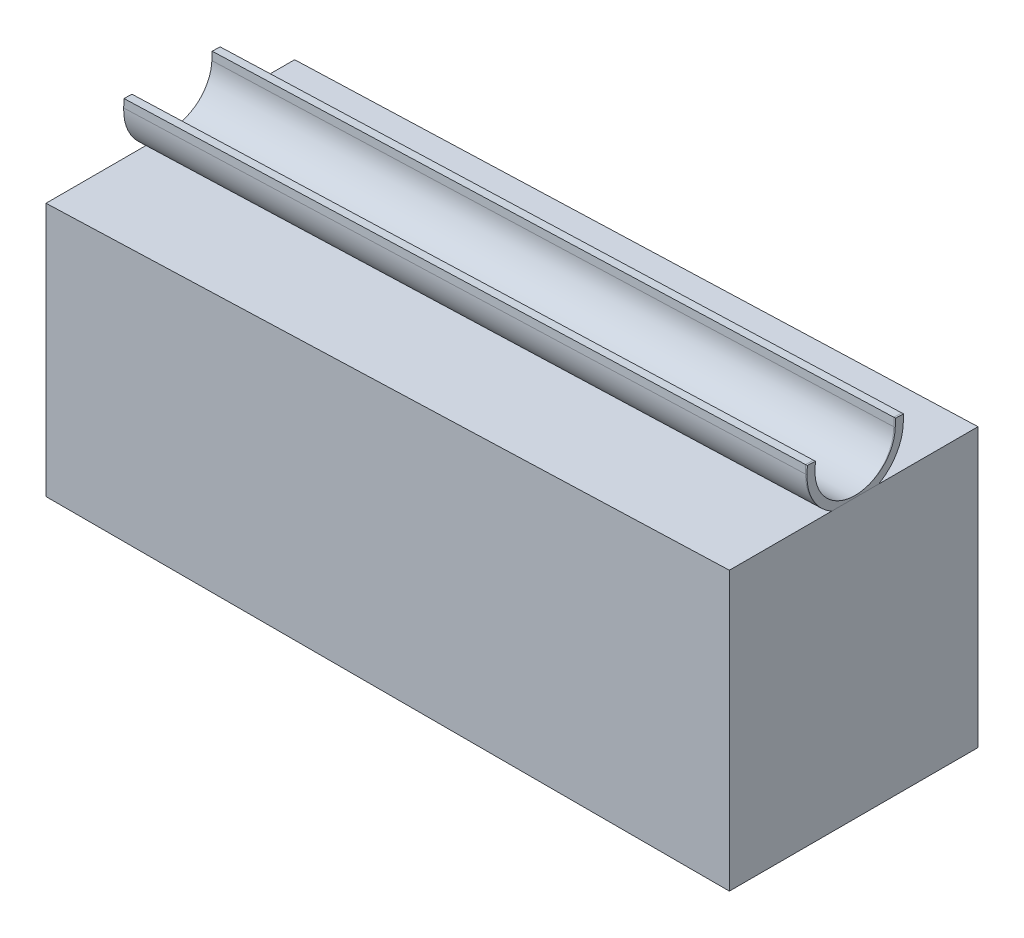
ISO-10303-21;
HEADER;
FILE_DESCRIPTION(('STEP AP214'),'2;1');
FILE_NAME('part.step','',(''),(''),'','','');
FILE_SCHEMA(('AUTOMOTIVE_DESIGN { 1 0 10303 214 1 1 1 1 }'));
ENDSEC;
DATA;
#1=APPLICATION_CONTEXT('core data for automotive mechanical design processes');
#2=APPLICATION_PROTOCOL_DEFINITION('international standard','automotive_design',2000,#1);
#3=PRODUCT_CONTEXT('',#1,'mechanical');
#4=PRODUCT('Part','Part','',(#3));
#5=PRODUCT_RELATED_PRODUCT_CATEGORY('part','',(#4));
#6=PRODUCT_DEFINITION_FORMATION('','',#4);
#7=PRODUCT_DEFINITION_CONTEXT('part definition',#1,'design');
#8=PRODUCT_DEFINITION('design','',#6,#7);
#9=PRODUCT_DEFINITION_SHAPE('','',#8);
#10=(LENGTH_UNIT() NAMED_UNIT(*) SI_UNIT(.MILLI.,.METRE.));
#11=(NAMED_UNIT(*) PLANE_ANGLE_UNIT() SI_UNIT($,.RADIAN.));
#12=(NAMED_UNIT(*) SI_UNIT($,.STERADIAN.) SOLID_ANGLE_UNIT());
#13=UNCERTAINTY_MEASURE_WITH_UNIT(LENGTH_MEASURE(1.E-05),#10,'distance_accuracy_value','');
#14=(GEOMETRIC_REPRESENTATION_CONTEXT(3) GLOBAL_UNCERTAINTY_ASSIGNED_CONTEXT((#13)) GLOBAL_UNIT_ASSIGNED_CONTEXT((#10,
#11,#12)) REPRESENTATION_CONTEXT('',''));
#15=CARTESIAN_POINT('',(0.,0.,0.));
#16=DIRECTION('',(0.,0.,1.));
#17=DIRECTION('',(1.,0.,0.));
#18=AXIS2_PLACEMENT_3D('',#15,#16,#17);
#19=CARTESIAN_POINT('',(-169.701294160395,-18.9137576322617,-75.6828257569866));
#20=DIRECTION('',(0.999390827019096,0.0348994967024938,0.));
#21=DIRECTION('',(-0.0348994967024938,0.999390827019096,0.));
#22=AXIS2_PLACEMENT_3D('',#19,#20,#21);
#23=CYLINDRICAL_SURFACE('',#22,6.00000000000004);
#24=DIRECTION('',(0.999390827019096,0.0348994967024938,0.));
#25=VECTOR('',#24,1.);
#26=CARTESIAN_POINT('',(-169.51857977592,-24.1460130245274,-78.6137162298316));
#27=LINE('',#26,#25);
#28=CARTESIAN_POINT('',(-80.,-21.0199553349445,-78.6137162298317));
#29=VERTEX_POINT('',#28);
#30=CARTESIAN_POINT('',(5.20948620237499,-18.0443745087617,-78.6137162298317));
#31=VERTEX_POINT('',#30);
#32=EDGE_CURVE('E51',#29,#31,#27,.T.);
#33=ORIENTED_EDGE('',*,*,#32,.F.);
#34=CARTESIAN_POINT('',(-80.,-15.7813194157757,-75.6828257569866));
#35=DIRECTION('',(1.,0.,0.));
#36=DIRECTION('',(0.,1.,0.));
#37=AXIS2_PLACEMENT_3D('',#34,#35,#36);
#38=ELLIPSE('',#37,6.00365726579297,6.00000000000004);
#39=CARTESIAN_POINT('',(-80.,-15.9908440327263,-81.6791707191012));
#40=VERTEX_POINT('',#39);
#41=EDGE_CURVE('E119',#29,#40,#38,.T.);
#42=ORIENTED_EDGE('',*,*,#41,.T.);
#43=DIRECTION('',(0.999390827019096,0.0348994967024938,0.));
#44=VECTOR('',#43,1.);
#45=CARTESIAN_POINT('',(-169.693986311175,-19.1230270534941,-81.6791707191012));
#46=LINE('',#45,#44);
#47=CARTESIAN_POINT('',(5.03407966712025,-13.0213885377284,-81.6791707191012));
#48=VERTEX_POINT('',#47);
#49=EDGE_CURVE('E65',#40,#48,#46,.T.);
#50=ORIENTED_EDGE('',*,*,#49,.T.);
#51=CARTESIAN_POINT('',(5.02677181789981,-12.812119116496,-75.6828257569866));
#52=DIRECTION('',(-0.999390827019096,-0.0348994967024938,0.));
#53=DIRECTION('',(0.0348994967024938,-0.999390827019096,0.));
#54=AXIS2_PLACEMENT_3D('',#51,#52,#53);
#55=CIRCLE('',#54,6.00000000000004);
#56=EDGE_CURVE('E124',#48,#31,#55,.T.);
#57=ORIENTED_EDGE('',*,*,#56,.T.);
#58=EDGE_LOOP('',(#33,#42,#50,#57));
#59=FACE_BOUND('',#58,.T.);
#60=ADVANCED_FACE('F44',(#59),#23,.T.);
#61=CARTESIAN_POINT('',(-169.51857977592,-24.1460130245274,-78.6137162298316));
#62=DIRECTION('',(-0.0348994967024938,0.999390827019096,0.));
#63=DIRECTION('',(-0.999390827019096,-0.0348994967024938,0.));
#64=AXIS2_PLACEMENT_3D('',#61,#62,#63);
#65=PLANE('',#64);
#66=DIRECTION('',(0.999390827019096,0.0348994967024938,0.));
#67=VECTOR('',#66,1.);
#68=CARTESIAN_POINT('',(-169.51857977592,-24.1460130245275,-72.7519352841415));
#69=LINE('',#68,#67);
#70=CARTESIAN_POINT('',(-80.,-21.0199553349446,-72.7519352841415));
#71=VERTEX_POINT('',#70);
#72=CARTESIAN_POINT('',(5.20948620237508,-18.0443745087619,-72.7519352841415));
#73=VERTEX_POINT('',#72);
#74=EDGE_CURVE('E150',#71,#73,#69,.T.);
#75=ORIENTED_EDGE('',*,*,#74,.F.);
#76=DIRECTION('',(0.,0.,-1.));
#77=VECTOR('',#76,1.);
#78=CARTESIAN_POINT('',(-80.,-21.0199553349445,-78.6137162298316));
#79=LINE('',#78,#77);
#80=EDGE_CURVE('E125',#71,#29,#79,.T.);
#81=ORIENTED_EDGE('',*,*,#80,.T.);
#82=ORIENTED_EDGE('',*,*,#32,.T.);
#83=DIRECTION('',(0.,0.,1.));
#84=VECTOR('',#83,1.);
#85=CARTESIAN_POINT('',(5.20948620237499,-18.0443745087617,-78.6137162298317));
#86=LINE('',#85,#84);
#87=EDGE_CURVE('E156',#31,#73,#86,.T.);
#88=ORIENTED_EDGE('',*,*,#87,.T.);
#89=EDGE_LOOP('',(#75,#81,#82,#88));
#90=FACE_BOUND('',#89,.T.);
#91=ADVANCED_FACE('F155',(#90),#65,.F.);
#92=CARTESIAN_POINT('',(-169.701294160395,-18.9137576322617,-75.6828257569866));
#93=DIRECTION('',(0.999390827019096,0.0348994967024938,0.));
#94=DIRECTION('',(-0.0348994967024938,0.999390827019096,0.));
#95=AXIS2_PLACEMENT_3D('',#92,#93,#94);
#96=CYLINDRICAL_SURFACE('',#95,6.00000000000026);
#97=DIRECTION('',(0.999390827019096,0.0348994967024938,0.));
#98=VECTOR('',#97,1.);
#99=CARTESIAN_POINT('',(-169.708602009616,-18.7044882110294,-69.6864807948718));
#100=LINE('',#99,#98);
#101=CARTESIAN_POINT('',(-80.,-15.5717947988253,-69.6864807948718));
#102=VERTEX_POINT('',#101);
#103=CARTESIAN_POINT('',(5.01946396867936,-12.6028496952637,-69.6864807948718));
#104=VERTEX_POINT('',#103);
#105=EDGE_CURVE('E148',#102,#104,#100,.T.);
#106=ORIENTED_EDGE('',*,*,#105,.F.);
#107=CARTESIAN_POINT('',(-80.,-15.7813194157757,-75.6828257569866));
#108=DIRECTION('',(1.,0.,0.));
#109=DIRECTION('',(0.,1.,0.));
#110=AXIS2_PLACEMENT_3D('',#107,#108,#109);
#111=ELLIPSE('',#110,6.00365726579319,6.00000000000026);
#112=EDGE_CURVE('E218',#102,#71,#111,.T.);
#113=ORIENTED_EDGE('',*,*,#112,.T.);
#114=ORIENTED_EDGE('',*,*,#74,.T.);
#115=CARTESIAN_POINT('',(5.02677181789981,-12.812119116496,-75.6828257569866));
#116=DIRECTION('',(-0.999390827019096,-0.0348994967024938,0.));
#117=DIRECTION('',(0.0348994967024938,-0.999390827019096,0.));
#118=AXIS2_PLACEMENT_3D('',#115,#116,#117);
#119=CIRCLE('',#118,6.00000000000026);
#120=EDGE_CURVE('E162',#73,#104,#119,.T.);
#121=ORIENTED_EDGE('',*,*,#120,.T.);
#122=EDGE_LOOP('',(#106,#113,#114,#121));
#123=FACE_BOUND('',#122,.T.);
#124=ADVANCED_FACE('F217',(#123),#96,.T.);
#125=CARTESIAN_POINT('',(-169.708602009616,-18.7044882110294,-69.6864807948718));
#126=DIRECTION('',(0.00121797487007891,-0.0348782368718155,-0.999390827019104));
#127=DIRECTION('',(0.,0.999391568299479,-0.0348782627421274));
#128=AXIS2_PLACEMENT_3D('',#125,#126,#127);
#129=PLANE('',#128);
#130=DIRECTION('',(0.999390827019096,0.0348994967024938,0.));
#131=VECTOR('',#130,1.);
#132=CARTESIAN_POINT('',(-169.743480246488,-17.7057061858995,-69.721380291574));
#133=LINE('',#132,#131);
#134=CARTESIAN_POINT('',(-80.,-14.5717947988253,-69.721380291574));
#135=VERTEX_POINT('',#134);
#136=CARTESIAN_POINT('',(4.98458573180731,-11.6040676701338,-69.721380291574));
#137=VERTEX_POINT('',#136);
#138=EDGE_CURVE('E146',#135,#137,#133,.T.);
#139=ORIENTED_EDGE('',*,*,#138,.F.);
#140=DIRECTION('',(0.,-0.999391568299479,0.0348782627421274));
#141=VECTOR('',#140,1.);
#142=CARTESIAN_POINT('',(-80.,-18.7006773107584,-69.5772843699648));
#143=LINE('',#142,#141);
#144=EDGE_CURVE('E214',#135,#102,#143,.T.);
#145=ORIENTED_EDGE('',*,*,#144,.T.);
#146=ORIENTED_EDGE('',*,*,#105,.T.);
#147=DIRECTION('',(-0.0348782368720561,0.998782025129921,-0.0348994967022536));
#148=VECTOR('',#147,1.);
#149=CARTESIAN_POINT('',(5.01946396867936,-12.6028496952637,-69.6864807948718));
#150=LINE('',#149,#148);
#151=EDGE_CURVE('E168',#104,#137,#150,.T.);
#152=ORIENTED_EDGE('',*,*,#151,.T.);
#153=EDGE_LOOP('',(#139,#145,#146,#152));
#154=FACE_BOUND('',#153,.T.);
#155=ADVANCED_FACE('F212',(#154),#129,.F.);
#156=CARTESIAN_POINT('',(-169.743480246488,-17.7057061858995,-69.721380291574));
#157=DIRECTION('',(0.0348782368720555,-0.998782025129913,0.0348994967024931));
#158=DIRECTION('',(0.,-0.0349207435583515,-0.999390084836412));
#159=AXIS2_PLACEMENT_3D('',#156,#157,#158);
#160=PLANE('',#159);
#161=DIRECTION('',(0.999390827019096,0.0348994967024938,0.));
#162=VECTOR('',#161,1.);
#163=CARTESIAN_POINT('',(-169.742262271618,-17.7405844227715,-70.7207711185936));
#164=LINE('',#163,#162);
#165=CARTESIAN_POINT('',(-80.,-14.6067155683169,-70.7207711185936));
#166=VERTEX_POINT('',#165);
#167=CARTESIAN_POINT('',(4.98580370667738,-11.6389459070059,-70.7207711185936));
#168=VERTEX_POINT('',#167);
#169=EDGE_CURVE('E144',#166,#168,#164,.T.);
#170=ORIENTED_EDGE('',*,*,#169,.F.);
#171=DIRECTION('',(0.,0.0349207435583515,0.999390084836412));
#172=VECTOR('',#171,1.);
#173=CARTESIAN_POINT('',(-80.,-14.5756164731738,-69.8307520592463));
#174=LINE('',#173,#172);
#175=EDGE_CURVE('E209',#166,#135,#174,.T.);
#176=ORIENTED_EDGE('',*,*,#175,.T.);
#177=ORIENTED_EDGE('',*,*,#138,.T.);
#178=DIRECTION('',(0.00121797487007335,-0.0348782368720552,-0.999390827019096));
#179=VECTOR('',#178,1.);
#180=CARTESIAN_POINT('',(4.98458573180731,-11.6040676701338,-69.721380291574));
#181=LINE('',#180,#179);
#182=EDGE_CURVE('E171',#137,#168,#181,.T.);
#183=ORIENTED_EDGE('',*,*,#182,.T.);
#184=EDGE_LOOP('',(#170,#176,#177,#183));
#185=FACE_BOUND('',#184,.T.);
#186=ADVANCED_FACE('F206',(#185),#160,.F.);
#187=CARTESIAN_POINT('',(-169.742262271618,-17.7405844227715,-70.7207711185936));
#188=DIRECTION('',(-0.00121797487009296,0.0348782368722177,0.99939082701909));
#189=DIRECTION('',(0.,-0.999391568299464,0.0348782627425297));
#190=AXIS2_PLACEMENT_3D('',#187,#188,#189);
#191=PLANE('',#190);
#192=DIRECTION('',(0.999390827019096,0.0348994967024938,0.));
#193=VECTOR('',#192,1.);
#194=CARTESIAN_POINT('',(-169.707384034746,-18.7393664479014,-70.685871621891));
#195=LINE('',#194,#193);
#196=CARTESIAN_POINT('',(-80.,-15.606715568317,-70.685871621891));
#197=VERTEX_POINT('',#196);
#198=CARTESIAN_POINT('',(5.02068194354944,-12.6377279321358,-70.685871621891));
#199=VERTEX_POINT('',#198);
#200=EDGE_CURVE('E142',#197,#199,#195,.T.);
#201=ORIENTED_EDGE('',*,*,#200,.F.);
#202=DIRECTION('',(0.,0.999391568299464,-0.0348782627425297));
#203=VECTOR('',#202,1.);
#204=CARTESIAN_POINT('',(-80.,-17.736772092583,-70.6115337212459));
#205=LINE('',#204,#203);
#206=EDGE_CURVE('E223',#197,#166,#205,.T.);
#207=ORIENTED_EDGE('',*,*,#206,.T.);
#208=ORIENTED_EDGE('',*,*,#169,.T.);
#209=DIRECTION('',(0.0348782368720562,-0.998782025129907,0.0348994967026561));
#210=VECTOR('',#209,1.);
#211=CARTESIAN_POINT('',(4.98580370667738,-11.6389459070059,-70.7207711185936));
#212=LINE('',#211,#210);
#213=EDGE_CURVE('E174',#168,#199,#212,.T.);
#214=ORIENTED_EDGE('',*,*,#213,.T.);
#215=EDGE_LOOP('',(#201,#207,#208,#214));
#216=FACE_BOUND('',#215,.T.);
#217=ADVANCED_FACE('F202',(#216),#191,.F.);
#218=CARTESIAN_POINT('',(-169.701294160395,-18.9137576322617,-75.6828257569866));
#219=DIRECTION('',(0.999390827019096,0.0348994967024938,0.));
#220=DIRECTION('',(-0.0348994967024938,0.999390827019096,0.));
#221=AXIS2_PLACEMENT_3D('',#218,#219,#220);
#222=CYLINDRICAL_SURFACE('',#221,5.00000000000016);
#223=DIRECTION('',(0.999390827019096,0.0348994967024938,0.));
#224=VECTOR('',#223,1.);
#225=CARTESIAN_POINT('',(-169.695204286045,-19.088148816622,-80.6797798920822));
#226=LINE('',#225,#224);
#227=CARTESIAN_POINT('',(-80.,-15.9559232632346,-80.6797798920822));
#228=VERTEX_POINT('',#227);
#229=CARTESIAN_POINT('',(5.03286169225018,-12.9865103008563,-80.6797798920823));
#230=VERTEX_POINT('',#229);
#231=EDGE_CURVE('E140',#228,#230,#226,.T.);
#232=ORIENTED_EDGE('',*,*,#231,.F.);
#233=CARTESIAN_POINT('',(-80.,-15.7813194157757,-75.6828257569866));
#234=DIRECTION('',(1.,0.,0.));
#235=DIRECTION('',(0.,1.,0.));
#236=AXIS2_PLACEMENT_3D('',#233,#234,#235);
#237=ELLIPSE('',#236,5.00304772149427,5.00000000000016);
#238=EDGE_CURVE('E199',#228,#197,#237,.F.);
#239=ORIENTED_EDGE('',*,*,#238,.T.);
#240=ORIENTED_EDGE('',*,*,#200,.T.);
#241=CARTESIAN_POINT('',(5.02677181789981,-12.812119116496,-75.6828257569866));
#242=DIRECTION('',(0.999390827019096,0.0348994967024938,0.));
#243=DIRECTION('',(0.0348994967024938,-0.999390827019096,0.));
#244=AXIS2_PLACEMENT_3D('',#241,#242,#243);
#245=CIRCLE('',#244,5.00000000000016);
#246=EDGE_CURVE('E177',#199,#230,#245,.T.);
#247=ORIENTED_EDGE('',*,*,#246,.T.);
#248=EDGE_LOOP('',(#232,#239,#240,#247));
#249=FACE_BOUND('',#248,.T.);
#250=ADVANCED_FACE('F197',(#249),#222,.F.);
#251=CARTESIAN_POINT('',(-169.695204286045,-19.088148816622,-80.6797798920822));
#252=DIRECTION('',(0.00121797487008279,-0.0348782368719264,-0.999390827019101));
#253=DIRECTION('',(0.,0.999391568299475,-0.0348782627422384));
#254=AXIS2_PLACEMENT_3D('',#251,#252,#253);
#255=PLANE('',#254);
#256=DIRECTION('',(0.999390827019096,0.0348994967024938,0.));
#257=VECTOR('',#256,1.);
#258=CARTESIAN_POINT('',(-169.730082522917,-18.0893667914921,-80.7146793887846));
#259=LINE('',#258,#257);
#260=CARTESIAN_POINT('',(-80.,-14.9559232632344,-80.7146793887846));
#261=VERTEX_POINT('',#260);
#262=CARTESIAN_POINT('',(4.99798345537812,-11.9877282757264,-80.7146793887846));
#263=VERTEX_POINT('',#262);
#264=EDGE_CURVE('E133',#261,#263,#259,.T.);
#265=ORIENTED_EDGE('',*,*,#264,.F.);
#266=DIRECTION('',(0.,-0.999391568299475,0.0348782627422384));
#267=VECTOR('',#266,1.);
#268=CARTESIAN_POINT('',(-80.,-19.0843384854981,-80.5705997753492));
#269=LINE('',#268,#267);
#270=EDGE_CURVE('E194',#261,#228,#269,.T.);
#271=ORIENTED_EDGE('',*,*,#270,.T.);
#272=ORIENTED_EDGE('',*,*,#231,.T.);
#273=DIRECTION('',(-0.0348782368720561,0.998782025129917,-0.0348994967023646));
#274=VECTOR('',#273,1.);
#275=CARTESIAN_POINT('',(5.03286169225018,-12.9865103008563,-80.6797798920823));
#276=LINE('',#275,#274);
#277=EDGE_CURVE('E180',#230,#263,#276,.T.);
#278=ORIENTED_EDGE('',*,*,#277,.T.);
#279=EDGE_LOOP('',(#265,#271,#272,#278));
#280=FACE_BOUND('',#279,.T.);
#281=ADVANCED_FACE('F191',(#280),#255,.F.);
#282=CARTESIAN_POINT('',(-169.730082522917,-18.0893667914921,-80.7146793887846));
#283=DIRECTION('',(0.0348782368720555,-0.998782025129913,0.0348994967024944));
#284=DIRECTION('',(0.,-0.0349207435583528,-0.999390084836412));
#285=AXIS2_PLACEMENT_3D('',#282,#283,#284);
#286=PLANE('',#285);
#287=DIRECTION('',(0.999390827019096,0.0348994967024938,0.));
#288=VECTOR('',#287,1.);
#289=CARTESIAN_POINT('',(-169.728864548047,-18.1242450283641,-81.7140702158037));
#290=LINE('',#289,#288);
#291=CARTESIAN_POINT('',(-80.,-14.9908440327262,-81.7140702158037));
#292=VERTEX_POINT('',#291);
#293=CARTESIAN_POINT('',(4.99920143024819,-12.0226065125985,-81.7140702158037));
#294=VERTEX_POINT('',#293);
#295=EDGE_CURVE('E131',#292,#294,#290,.T.);
#296=ORIENTED_EDGE('',*,*,#295,.F.);
#297=DIRECTION('',(0.,0.0349207435583528,0.999390084836412));
#298=VECTOR('',#297,1.);
#299=CARTESIAN_POINT('',(-80.,-14.9597443670487,-80.8240348284439));
#300=LINE('',#299,#298);
#301=EDGE_CURVE('E58',#292,#261,#300,.T.);
#302=ORIENTED_EDGE('',*,*,#301,.T.);
#303=ORIENTED_EDGE('',*,*,#264,.T.);
#304=DIRECTION('',(0.00121797487007395,-0.0348782368720566,-0.999390827019096));
#305=VECTOR('',#304,1.);
#306=CARTESIAN_POINT('',(4.99798345537812,-11.9877282757264,-80.7146793887846));
#307=LINE('',#306,#305);
#308=EDGE_CURVE('E135',#263,#294,#307,.T.);
#309=ORIENTED_EDGE('',*,*,#308,.T.);
#310=EDGE_LOOP('',(#296,#302,#303,#309));
#311=FACE_BOUND('',#310,.T.);
#312=ADVANCED_FACE('F185',(#311),#286,.F.);
#313=CARTESIAN_POINT('',(-169.728864548047,-18.1242450283641,-81.7140702158037));
#314=DIRECTION('',(-0.00121797487008908,0.0348782368721067,0.999390827019094));
#315=DIRECTION('',(0.,-0.999391568299468,0.0348782627424187));
#316=AXIS2_PLACEMENT_3D('',#313,#314,#315);
#317=PLANE('',#316);
#318=ORIENTED_EDGE('',*,*,#49,.F.);
#319=DIRECTION('',(0.,0.999391568299468,-0.0348782627424187));
#320=VECTOR('',#319,1.);
#321=CARTESIAN_POINT('',(-80.,-18.1204332673227,-81.6048491266306));
#322=LINE('',#321,#320);
#323=EDGE_CURVE('E12',#40,#292,#322,.T.);
#324=ORIENTED_EDGE('',*,*,#323,.T.);
#325=ORIENTED_EDGE('',*,*,#295,.T.);
#326=DIRECTION('',(0.0348782368720561,-0.998782025129911,0.0348994967025451));
#327=VECTOR('',#326,1.);
#328=CARTESIAN_POINT('',(4.99920143024819,-12.0226065125985,-81.7140702158037));
#329=LINE('',#328,#327);
#330=EDGE_CURVE('E129',#294,#48,#329,.T.);
#331=ORIENTED_EDGE('',*,*,#330,.T.);
#332=EDGE_LOOP('',(#318,#324,#325,#331));
#333=FACE_BOUND('',#332,.T.);
#334=ADVANCED_FACE('F127',(#333),#317,.F.);
#335=CARTESIAN_POINT('',(5.02677181789981,-12.812119116496,-75.6828257569866));
#336=DIRECTION('',(-0.999390827019096,-0.0348994967024938,0.));
#337=DIRECTION('',(0.0348994967024938,-0.999390827019096,0.));
#338=AXIS2_PLACEMENT_3D('',#335,#336,#337);
#339=PLANE('',#338);
#340=ORIENTED_EDGE('',*,*,#56,.F.);
#341=ORIENTED_EDGE('',*,*,#330,.F.);
#342=ORIENTED_EDGE('',*,*,#308,.F.);
#343=ORIENTED_EDGE('',*,*,#277,.F.);
#344=ORIENTED_EDGE('',*,*,#246,.F.);
#345=ORIENTED_EDGE('',*,*,#213,.F.);
#346=ORIENTED_EDGE('',*,*,#182,.F.);
#347=ORIENTED_EDGE('',*,*,#151,.F.);
#348=ORIENTED_EDGE('',*,*,#120,.F.);
#349=ORIENTED_EDGE('',*,*,#87,.F.);
#350=EDGE_LOOP('',(#340,#341,#342,#343,#344,#345,#346,#347,#348,#349));
#351=FACE_BOUND('',#350,.T.);
#352=ADVANCED_FACE('F159',(#351),#339,.F.);
#353=CARTESIAN_POINT('',(-80.,-157.531312227516,60.));
#354=DIRECTION('',(1.,0.,0.));
#355=DIRECTION('',(0.,0.,-1.));
#356=AXIS2_PLACEMENT_3D('',#353,#354,#355);
#357=PLANE('',#356);
#358=ORIENTED_EDGE('',*,*,#80,.F.);
#359=ORIENTED_EDGE('',*,*,#112,.F.);
#360=ORIENTED_EDGE('',*,*,#144,.F.);
#361=ORIENTED_EDGE('',*,*,#175,.F.);
#362=ORIENTED_EDGE('',*,*,#206,.F.);
#363=ORIENTED_EDGE('',*,*,#238,.F.);
#364=ORIENTED_EDGE('',*,*,#270,.F.);
#365=ORIENTED_EDGE('',*,*,#301,.F.);
#366=ORIENTED_EDGE('',*,*,#323,.F.);
#367=ORIENTED_EDGE('',*,*,#41,.F.);
#368=EDGE_LOOP('',(#358,#359,#360,#361,#362,#363,#364,#365,#366,#367));
#369=FACE_BOUND('',#368,.T.);
#370=ADVANCED_FACE('F118',(#369),#357,.F.);
#371=CLOSED_SHELL('',(#60,#91,#124,#155,#186,#217,#250,#281,#312,#334,#352,#370));
#372=MANIFOLD_SOLID_BREP('B2',#371);
#373=CARTESIAN_POINT('',(78.,500000.,-60.));
#374=DIRECTION('',(0.,0.,1.));
#375=DIRECTION('',(1.,0.,0.));
#376=AXIS2_PLACEMENT_3D('',#373,#374,#375);
#377=PLANE('',#376);
#378=DIRECTION('',(0.,1.,0.));
#379=VECTOR('',#378,1.);
#380=CARTESIAN_POINT('',(-80.,500000.,-60.));
#381=LINE('',#380,#379);
#382=CARTESIAN_POINT('',(-80.,-52.6973639920811,-60.));
#383=VERTEX_POINT('',#382);
#384=CARTESIAN_POINT('',(-80.,-21.019955334976,-60.));
#385=VERTEX_POINT('',#384);
#386=EDGE_CURVE('E352',#383,#385,#381,.T.);
#387=ORIENTED_EDGE('',*,*,#386,.F.);
#388=DIRECTION('',(-1.,0.,0.));
#389=VECTOR('',#388,1.);
#390=CARTESIAN_POINT('',(5.20948620237505,-52.6973639920468,-60.));
#391=LINE('',#390,#389);
#392=CARTESIAN_POINT('',(5.20948620237505,-52.6973639920468,-60.));
#393=VERTEX_POINT('',#392);
#394=EDGE_CURVE('E374',#393,#383,#391,.T.);
#395=ORIENTED_EDGE('',*,*,#394,.F.);
#396=DIRECTION('',(0.,-1.,0.));
#397=VECTOR('',#396,1.);
#398=CARTESIAN_POINT('',(5.20948620237505,-52.6973639920468,-60.));
#399=LINE('',#398,#397);
#400=CARTESIAN_POINT('',(5.20948620237505,-18.0443745087618,-60.));
#401=VERTEX_POINT('',#400);
#402=EDGE_CURVE('E376',#401,#393,#399,.T.);
#403=ORIENTED_EDGE('',*,*,#402,.F.);
#404=DIRECTION('',(0.999390827019083,0.0348994967028617,0.));
#405=VECTOR('',#404,1.);
#406=CARTESIAN_POINT('',(5.20948620237505,-18.0443745087618,-60.));
#407=LINE('',#406,#405);
#408=EDGE_CURVE('E380',#385,#401,#407,.T.);
#409=ORIENTED_EDGE('',*,*,#408,.F.);
#410=EDGE_LOOP('',(#387,#395,#403,#409));
#411=FACE_BOUND('',#410,.T.);
#412=ADVANCED_FACE('F339',(#411),#377,.T.);
#413=CARTESIAN_POINT('',(0.,0.,-91.));
#414=DIRECTION('',(0.,0.,1.));
#415=DIRECTION('',(1.,0.,0.));
#416=AXIS2_PLACEMENT_3D('',#413,#414,#415);
#417=PLANE('',#416);
#418=DIRECTION('',(-1.,0.,0.));
#419=VECTOR('',#418,1.);
#420=CARTESIAN_POINT('',(5.20948620237505,-52.6973639920468,-91.));
#421=LINE('',#420,#419);
#422=CARTESIAN_POINT('',(5.20948620237505,-52.6973639920468,-91.));
#423=VERTEX_POINT('',#422);
#424=CARTESIAN_POINT('',(-80.,-52.6973639920468,-91.));
#425=VERTEX_POINT('',#424);
#426=EDGE_CURVE('E389',#423,#425,#421,.T.);
#427=ORIENTED_EDGE('',*,*,#426,.T.);
#428=DIRECTION('',(0.,1.,0.));
#429=VECTOR('',#428,1.);
#430=CARTESIAN_POINT('',(-80.,0.,-91.));
#431=LINE('',#430,#429);
#432=CARTESIAN_POINT('',(-80.,-21.019955334976,-91.));
#433=VERTEX_POINT('',#432);
#434=EDGE_CURVE('E401',#425,#433,#431,.T.);
#435=ORIENTED_EDGE('',*,*,#434,.T.);
#436=DIRECTION('',(0.999390827019083,0.0348994967028617,0.));
#437=VECTOR('',#436,1.);
#438=CARTESIAN_POINT('',(5.20948620237505,-18.0443745087618,-91.));
#439=LINE('',#438,#437);
#440=CARTESIAN_POINT('',(5.20948620237505,-18.0443745087618,-91.));
#441=VERTEX_POINT('',#440);
#442=EDGE_CURVE('E381',#433,#441,#439,.T.);
#443=ORIENTED_EDGE('',*,*,#442,.T.);
#444=DIRECTION('',(0.,-1.,0.));
#445=VECTOR('',#444,1.);
#446=CARTESIAN_POINT('',(5.20948620237505,-52.6973639920468,-91.));
#447=LINE('',#446,#445);
#448=EDGE_CURVE('E394',#441,#423,#447,.T.);
#449=ORIENTED_EDGE('',*,*,#448,.T.);
#450=EDGE_LOOP('',(#427,#435,#443,#449));
#451=FACE_BOUND('',#450,.T.);
#452=ADVANCED_FACE('F407',(#451),#417,.F.);
#453=CARTESIAN_POINT('',(5.20948620237505,-52.6973639920468,148.114783010654));
#454=DIRECTION('',(0.,-1.,0.));
#455=DIRECTION('',(0.,0.,-1.));
#456=AXIS2_PLACEMENT_3D('',#453,#454,#455);
#457=PLANE('',#456);
#458=DIRECTION('',(0.,0.,1.));
#459=VECTOR('',#458,1.);
#460=CARTESIAN_POINT('',(-80.,-52.6973639920468,148.114783010654));
#461=LINE('',#460,#459);
#462=EDGE_CURVE('E396',#425,#383,#461,.T.);
#463=ORIENTED_EDGE('',*,*,#462,.F.);
#464=ORIENTED_EDGE('',*,*,#426,.F.);
#465=DIRECTION('',(0.,0.,-1.));
#466=VECTOR('',#465,1.);
#467=CARTESIAN_POINT('',(5.20948620237505,-52.6973639920468,148.114783010654));
#468=LINE('',#467,#466);
#469=EDGE_CURVE('E346',#393,#423,#468,.T.);
#470=ORIENTED_EDGE('',*,*,#469,.F.);
#471=ORIENTED_EDGE('',*,*,#394,.T.);
#472=EDGE_LOOP('',(#463,#464,#470,#471));
#473=FACE_BOUND('',#472,.T.);
#474=ADVANCED_FACE('F387',(#473),#457,.T.);
#475=CARTESIAN_POINT('',(5.20948620237505,-18.0443745087618,148.114783010654));
#476=DIRECTION('',(-0.0348994967028617,0.999390827019083,0.));
#477=DIRECTION('',(-0.999390827019083,-0.0348994967028617,0.));
#478=AXIS2_PLACEMENT_3D('',#475,#476,#477);
#479=PLANE('',#478);
#480=DIRECTION('',(0.,0.,-1.));
#481=VECTOR('',#480,1.);
#482=CARTESIAN_POINT('',(-80.,-21.019955334976,148.114783010654));
#483=LINE('',#482,#481);
#484=EDGE_CURVE('E42',#385,#433,#483,.T.);
#485=ORIENTED_EDGE('',*,*,#484,.F.);
#486=ORIENTED_EDGE('',*,*,#408,.T.);
#487=DIRECTION('',(0.,0.,-1.));
#488=VECTOR('',#487,1.);
#489=CARTESIAN_POINT('',(5.20948620237505,-18.0443745087618,148.114783010654));
#490=LINE('',#489,#488);
#491=EDGE_CURVE('E385',#401,#441,#490,.T.);
#492=ORIENTED_EDGE('',*,*,#491,.T.);
#493=ORIENTED_EDGE('',*,*,#442,.F.);
#494=EDGE_LOOP('',(#485,#486,#492,#493));
#495=FACE_BOUND('',#494,.T.);
#496=ADVANCED_FACE('F411',(#495),#479,.T.);
#497=CARTESIAN_POINT('',(5.20948620237505,-52.6973639920468,148.114783010654));
#498=DIRECTION('',(1.,0.,0.));
#499=DIRECTION('',(0.,0.,-1.));
#500=AXIS2_PLACEMENT_3D('',#497,#498,#499);
#501=PLANE('',#500);
#502=ORIENTED_EDGE('',*,*,#491,.F.);
#503=ORIENTED_EDGE('',*,*,#402,.T.);
#504=ORIENTED_EDGE('',*,*,#469,.T.);
#505=ORIENTED_EDGE('',*,*,#448,.F.);
#506=EDGE_LOOP('',(#502,#503,#504,#505));
#507=FACE_BOUND('',#506,.T.);
#508=ADVANCED_FACE('F383',(#507),#501,.T.);
#509=CARTESIAN_POINT('',(-80.,-157.531312227516,60.));
#510=DIRECTION('',(1.,0.,0.));
#511=DIRECTION('',(0.,0.,-1.));
#512=AXIS2_PLACEMENT_3D('',#509,#510,#511);
#513=PLANE('',#512);
#514=ORIENTED_EDGE('',*,*,#462,.T.);
#515=ORIENTED_EDGE('',*,*,#386,.T.);
#516=ORIENTED_EDGE('',*,*,#484,.T.);
#517=ORIENTED_EDGE('',*,*,#434,.F.);
#518=EDGE_LOOP('',(#514,#515,#516,#517));
#519=FACE_BOUND('',#518,.T.);
#520=ADVANCED_FACE('F412',(#519),#513,.F.);
#521=CLOSED_SHELL('',(#412,#452,#474,#496,#508,#520));
#522=MANIFOLD_SOLID_BREP('B6',#521);
#523=CARTESIAN_POINT('',(109.326423210238,-9.1698950321553,-75.6828257569866));
#524=DIRECTION('',(-0.999390827019096,-0.0348994967024938,0.));
#525=DIRECTION('',(0.0348994967024938,-0.999390827019096,0.));
#526=AXIS2_PLACEMENT_3D('',#523,#524,#525);
#527=CYLINDRICAL_SURFACE('',#526,6.00000000000017);
#528=CARTESIAN_POINT('',(5.20948620237505,-12.805738589593,-75.6828257569866));
#529=DIRECTION('',(-1.,0.,0.));
#530=DIRECTION('',(0.,-1.,0.));
#531=AXIS2_PLACEMENT_3D('',#528,#529,#530);
#532=ELLIPSE('',#531,6.0036572657931,6.00000000000017);
#533=CARTESIAN_POINT('',(5.20948620237505,-12.5962139726422,-69.6864807948717));
#534=VERTEX_POINT('',#533);
#535=CARTESIAN_POINT('',(5.20948620237505,-18.0443745087611,-72.7519352841403));
#536=VERTEX_POINT('',#535);
#537=EDGE_CURVE('E576',#534,#536,#532,.F.);
#538=ORIENTED_EDGE('',*,*,#537,.F.);
#539=DIRECTION('',(-0.999390827019096,-0.0348994967024938,0.));
#540=VECTOR('',#539,1.);
#541=CARTESIAN_POINT('',(109.319115361018,-8.96062561092295,-69.6864807948717));
#542=LINE('',#541,#540);
#543=CARTESIAN_POINT('',(5.01946396867937,-12.6028496952637,-69.6864807948717));
#544=VERTEX_POINT('',#543);
#545=EDGE_CURVE('E485',#534,#544,#542,.T.);
#546=ORIENTED_EDGE('',*,*,#545,.T.);
#547=CARTESIAN_POINT('',(5.0267718178998,-12.812119116496,-75.6828257569866));
#548=DIRECTION('',(-0.999390827019096,-0.0348994967024938,0.));
#549=DIRECTION('',(-0.00121797487007391,0.034878236872056,0.999390827019096));
#550=AXIS2_PLACEMENT_3D('',#547,#548,#549);
#551=CIRCLE('',#550,6.00000000000017);
#552=EDGE_CURVE('E572',#536,#544,#551,.T.);
#553=ORIENTED_EDGE('',*,*,#552,.F.);
#554=EDGE_LOOP('',(#538,#546,#553));
#555=FACE_BOUND('',#554,.T.);
#556=ADVANCED_FACE('F463',(#555),#527,.T.);
#557=CARTESIAN_POINT('',(5.20948620237505,-12.805738589593,-75.6828257569866));
#558=DIRECTION('',(-1.,0.,0.));
#559=DIRECTION('',(0.,-1.,0.));
#560=AXIS2_PLACEMENT_3D('',#557,#558,#559);
#561=ELLIPSE('',#560,6.0036572657931,6.00000000000017);
#562=CARTESIAN_POINT('',(5.20948620237505,-18.0443745087633,-78.6137162298289));
#563=VERTEX_POINT('',#562);
#564=CARTESIAN_POINT('',(5.20948620237504,-13.0152632065434,-81.6791707191012));
#565=VERTEX_POINT('',#564);
#566=EDGE_CURVE('E477',#563,#565,#561,.F.);
#567=ORIENTED_EDGE('',*,*,#566,.F.);
#568=CARTESIAN_POINT('',(5.03407966712026,-13.0213885377284,-81.6791707191012));
#569=VERTEX_POINT('',#568);
#570=EDGE_CURVE('E575',#569,#563,#551,.T.);
#571=ORIENTED_EDGE('',*,*,#570,.F.);
#572=DIRECTION('',(-0.999390827019096,-0.0348994967024938,0.));
#573=VECTOR('',#572,1.);
#574=CARTESIAN_POINT('',(109.333731059459,-9.37916445338763,-81.6791707191012));
#575=LINE('',#574,#573);
#576=EDGE_CURVE('E552',#565,#569,#575,.T.);
#577=ORIENTED_EDGE('',*,*,#576,.F.);
#578=EDGE_LOOP('',(#567,#571,#577));
#579=FACE_BOUND('',#578,.T.);
#580=ADVANCED_FACE('F634',(#579),#527,.T.);
#581=CARTESIAN_POINT('',(5.0267718178998,-12.812119116496,-75.6828257569866));
#582=DIRECTION('',(-0.999390827019096,-0.0348994967024938,0.));
#583=DIRECTION('',(-0.00121797487007391,0.034878236872056,0.999390827019096));
#584=AXIS2_PLACEMENT_3D('',#581,#582,#583);
#585=PLANE('',#584);
#586=DIRECTION('',(0.,0.,1.));
#587=VECTOR('',#586,1.);
#588=CARTESIAN_POINT('',(5.20948620237505,-18.0443745087618,-91.));
#589=LINE('',#588,#587);
#590=EDGE_CURVE('E471',#563,#536,#589,.T.);
#591=ORIENTED_EDGE('',*,*,#590,.T.);
#592=ORIENTED_EDGE('',*,*,#552,.T.);
#593=DIRECTION('',(-0.0348782368720561,0.998782025129918,-0.0348994967023551));
#594=VECTOR('',#593,1.);
#595=CARTESIAN_POINT('',(4.98458573180731,-11.6040676701338,-69.721380291574));
#596=LINE('',#595,#594);
#597=CARTESIAN_POINT('',(4.98458573180731,-11.6040676701338,-69.721380291574));
#598=VERTEX_POINT('',#597);
#599=EDGE_CURVE('E556',#544,#598,#596,.T.);
#600=ORIENTED_EDGE('',*,*,#599,.T.);
#601=DIRECTION('',(0.00121797487007391,-0.034878236872056,-0.999390827019096));
#602=VECTOR('',#601,1.);
#603=CARTESIAN_POINT('',(4.98580370667738,-11.6389459070058,-70.7207711185936));
#604=LINE('',#603,#602);
#605=CARTESIAN_POINT('',(4.98580370667738,-11.6389459070058,-70.7207711185936));
#606=VERTEX_POINT('',#605);
#607=EDGE_CURVE('E593',#598,#606,#604,.T.);
#608=ORIENTED_EDGE('',*,*,#607,.T.);
#609=DIRECTION('',(0.0348782368720558,-0.998782025129907,0.0348994967026602));
#610=VECTOR('',#609,1.);
#611=CARTESIAN_POINT('',(5.02068194354945,-12.6377279321358,-70.685871621891));
#612=LINE('',#611,#610);
#613=CARTESIAN_POINT('',(5.02068194354945,-12.6377279321358,-70.685871621891));
#614=VERTEX_POINT('',#613);
#615=EDGE_CURVE('E590',#606,#614,#612,.T.);
#616=ORIENTED_EDGE('',*,*,#615,.T.);
#617=CARTESIAN_POINT('',(5.0267718178998,-12.812119116496,-75.6828257569866));
#618=DIRECTION('',(0.999390827019096,0.0348994967024938,0.));
#619=DIRECTION('',(-0.00121797487007391,0.034878236872056,0.999390827019096));
#620=AXIS2_PLACEMENT_3D('',#617,#618,#619);
#621=CIRCLE('',#620,5.00000000000017);
#622=CARTESIAN_POINT('',(5.03286169225019,-12.9865103008563,-80.6797798920823));
#623=VERTEX_POINT('',#622);
#624=EDGE_CURVE('E587',#614,#623,#621,.T.);
#625=ORIENTED_EDGE('',*,*,#624,.T.);
#626=DIRECTION('',(-0.0348782368720562,0.998782025129919,-0.0348994967023274));
#627=VECTOR('',#626,1.);
#628=CARTESIAN_POINT('',(4.99798345537812,-11.9877282757264,-80.7146793887846));
#629=LINE('',#628,#627);
#630=CARTESIAN_POINT('',(4.99798345537812,-11.9877282757264,-80.7146793887846));
#631=VERTEX_POINT('',#630);
#632=EDGE_CURVE('E584',#623,#631,#629,.T.);
#633=ORIENTED_EDGE('',*,*,#632,.T.);
#634=DIRECTION('',(0.00121797487007391,-0.034878236872056,-0.999390827019096));
#635=VECTOR('',#634,1.);
#636=CARTESIAN_POINT('',(4.99920143024819,-12.0226065125985,-81.7140702158037));
#637=LINE('',#636,#635);
#638=CARTESIAN_POINT('',(4.99920143024819,-12.0226065125985,-81.7140702158037));
#639=VERTEX_POINT('',#638);
#640=EDGE_CURVE('E582',#631,#639,#637,.T.);
#641=ORIENTED_EDGE('',*,*,#640,.T.);
#642=DIRECTION('',(0.0348782368720559,-0.998782025129912,0.0348994967025215));
#643=VECTOR('',#642,1.);
#644=CARTESIAN_POINT('',(5.03407966712026,-13.0213885377284,-81.6791707191012));
#645=LINE('',#644,#643);
#646=EDGE_CURVE('E550',#639,#569,#645,.T.);
#647=ORIENTED_EDGE('',*,*,#646,.T.);
#648=ORIENTED_EDGE('',*,*,#570,.T.);
#649=EDGE_LOOP('',(#591,#592,#600,#608,#616,#625,#633,#641,#647,#648));
#650=FACE_BOUND('',#649,.T.);
#651=ADVANCED_FACE('F570',(#650),#585,.T.);
#652=CARTESIAN_POINT('',(109.284237124146,-7.96184358579303,-69.721380291574));
#653=DIRECTION('',(-0.00121797487008253,0.0348782368719169,0.999390827019101));
#654=DIRECTION('',(0.,-0.999391568299475,0.0348782627422288));
#655=AXIS2_PLACEMENT_3D('',#652,#653,#654);
#656=PLANE('',#655);
#657=DIRECTION('',(0.,-0.999391568299475,0.0348782627422288));
#658=VECTOR('',#657,1.);
#659=CARTESIAN_POINT('',(5.20948620237505,-7.96626477269822,-69.8480636917072));
#660=LINE('',#659,#658);
#661=CARTESIAN_POINT('',(5.20948620237505,-11.5962139726425,-69.721380291574));
#662=VERTEX_POINT('',#661);
#663=EDGE_CURVE('E599',#662,#534,#660,.T.);
#664=ORIENTED_EDGE('',*,*,#663,.F.);
#665=DIRECTION('',(-0.999390827019096,-0.0348994967024938,0.));
#666=VECTOR('',#665,1.);
#667=CARTESIAN_POINT('',(109.284237124146,-7.96184358579303,-69.721380291574));
#668=LINE('',#667,#666);
#669=EDGE_CURVE('E565',#662,#598,#668,.T.);
#670=ORIENTED_EDGE('',*,*,#669,.T.);
#671=ORIENTED_EDGE('',*,*,#599,.F.);
#672=ORIENTED_EDGE('',*,*,#545,.F.);
#673=EDGE_LOOP('',(#664,#670,#671,#672));
#674=FACE_BOUND('',#673,.T.);
#675=ADVANCED_FACE('F465',(#674),#656,.T.);
#676=CARTESIAN_POINT('',(109.285455099016,-7.9967218226651,-70.7207711185936));
#677=DIRECTION('',(-0.0348782368720555,0.998782025129913,-0.0348994967024938));
#678=DIRECTION('',(0.,0.0349207435583522,0.999390084836412));
#679=AXIS2_PLACEMENT_3D('',#676,#677,#678);
#680=PLANE('',#679);
#681=DIRECTION('',(0.,0.0349207435583522,0.999390084836412));
#682=VECTOR('',#681,1.);
#683=CARTESIAN_POINT('',(5.20948620237505,-11.6267027270225,-70.5939321252855));
#684=LINE('',#683,#682);
#685=CARTESIAN_POINT('',(5.20948620237505,-11.6311347421345,-70.7207711185936));
#686=VERTEX_POINT('',#685);
#687=EDGE_CURVE('E605',#686,#662,#684,.T.);
#688=ORIENTED_EDGE('',*,*,#687,.F.);
#689=DIRECTION('',(-0.999390827019096,-0.0348994967024938,0.));
#690=VECTOR('',#689,1.);
#691=CARTESIAN_POINT('',(109.285455099016,-7.9967218226651,-70.7207711185936));
#692=LINE('',#691,#690);
#693=EDGE_CURVE('E563',#686,#606,#692,.T.);
#694=ORIENTED_EDGE('',*,*,#693,.T.);
#695=ORIENTED_EDGE('',*,*,#607,.F.);
#696=ORIENTED_EDGE('',*,*,#669,.F.);
#697=EDGE_LOOP('',(#688,#694,#695,#696));
#698=FACE_BOUND('',#697,.T.);
#699=ADVANCED_FACE('F602',(#698),#680,.T.);
#700=CARTESIAN_POINT('',(109.320333335888,-8.99550384779501,-70.685871621891));
#701=DIRECTION('',(0.00121797487009318,-0.0348782368722218,-0.99939082701909));
#702=DIRECTION('',(0.,0.999391568299464,-0.0348782627425338));
#703=AXIS2_PLACEMENT_3D('',#700,#701,#702);
#704=PLANE('',#703);
#705=DIRECTION('',(0.,0.999391568299464,-0.0348782627425338));
#706=VECTOR('',#705,1.);
#707=CARTESIAN_POINT('',(5.20948620237505,-8.99992656809908,-70.8125989595874));
#708=LINE('',#707,#706);
#709=CARTESIAN_POINT('',(5.20948620237505,-12.6311347421342,-70.685871621891));
#710=VERTEX_POINT('',#709);
#711=EDGE_CURVE('E620',#710,#686,#708,.T.);
#712=ORIENTED_EDGE('',*,*,#711,.F.);
#713=DIRECTION('',(-0.999390827019096,-0.0348994967024938,0.));
#714=VECTOR('',#713,1.);
#715=CARTESIAN_POINT('',(109.320333335888,-8.99550384779501,-70.685871621891));
#716=LINE('',#715,#714);
#717=EDGE_CURVE('E561',#710,#614,#716,.T.);
#718=ORIENTED_EDGE('',*,*,#717,.T.);
#719=ORIENTED_EDGE('',*,*,#615,.F.);
#720=ORIENTED_EDGE('',*,*,#693,.F.);
#721=EDGE_LOOP('',(#712,#718,#719,#720));
#722=FACE_BOUND('',#721,.T.);
#723=ADVANCED_FACE('F608',(#722),#704,.T.);
#724=CARTESIAN_POINT('',(109.326423210238,-9.1698950321553,-75.6828257569866));
#725=DIRECTION('',(-0.999390827019096,-0.0348994967024938,0.));
#726=DIRECTION('',(0.0348994967024938,-0.999390827019096,0.));
#727=AXIS2_PLACEMENT_3D('',#724,#725,#726);
#728=CYLINDRICAL_SURFACE('',#727,5.00000000000017);
#729=CARTESIAN_POINT('',(5.20948620237505,-12.805738589593,-75.6828257569866));
#730=DIRECTION('',(-1.,0.,0.));
#731=DIRECTION('',(0.,-1.,0.));
#732=AXIS2_PLACEMENT_3D('',#729,#730,#731);
#733=ELLIPSE('',#732,5.00304772149428,5.00000000000017);
#734=CARTESIAN_POINT('',(5.20948620237505,-12.9803424370524,-80.6797798920823));
#735=VERTEX_POINT('',#734);
#736=EDGE_CURVE('E616',#735,#710,#733,.T.);
#737=ORIENTED_EDGE('',*,*,#736,.F.);
#738=DIRECTION('',(-0.999390827019096,-0.0348994967024938,0.));
#739=VECTOR('',#738,1.);
#740=CARTESIAN_POINT('',(109.332513084589,-9.34428621651558,-80.6797798920823));
#741=LINE('',#740,#739);
#742=EDGE_CURVE('E554',#735,#623,#741,.T.);
#743=ORIENTED_EDGE('',*,*,#742,.T.);
#744=ORIENTED_EDGE('',*,*,#624,.F.);
#745=ORIENTED_EDGE('',*,*,#717,.F.);
#746=EDGE_LOOP('',(#737,#743,#744,#745));
#747=FACE_BOUND('',#746,.T.);
#748=ADVANCED_FACE('F614',(#747),#728,.F.);
#749=CARTESIAN_POINT('',(109.297634847717,-8.34550419138566,-80.7146793887846));
#750=DIRECTION('',(-0.00121797487008157,0.0348782368718892,0.999390827019102));
#751=DIRECTION('',(0.,-0.999391568299476,0.0348782627422011));
#752=AXIS2_PLACEMENT_3D('',#749,#750,#751);
#753=PLANE('',#752);
#754=DIRECTION('',(0.,-0.999391568299476,0.0348782627422011));
#755=VECTOR('',#754,1.);
#756=CARTESIAN_POINT('',(5.20948620237505,-8.34992594743792,-80.841379097092));
#757=LINE('',#756,#755);
#758=CARTESIAN_POINT('',(5.20948620237505,-11.9803424370517,-80.7146793887846));
#759=VERTEX_POINT('',#758);
#760=EDGE_CURVE('E546',#759,#735,#757,.T.);
#761=ORIENTED_EDGE('',*,*,#760,.F.);
#762=DIRECTION('',(-0.999390827019096,-0.0348994967024938,0.));
#763=VECTOR('',#762,1.);
#764=CARTESIAN_POINT('',(109.297634847717,-8.34550419138566,-80.7146793887846));
#765=LINE('',#764,#763);
#766=EDGE_CURVE('E545',#759,#631,#765,.T.);
#767=ORIENTED_EDGE('',*,*,#766,.T.);
#768=ORIENTED_EDGE('',*,*,#632,.F.);
#769=ORIENTED_EDGE('',*,*,#742,.F.);
#770=EDGE_LOOP('',(#761,#767,#768,#769));
#771=FACE_BOUND('',#770,.T.);
#772=ADVANCED_FACE('F618',(#771),#753,.T.);
#773=CARTESIAN_POINT('',(109.298852822587,-8.38038242825772,-81.7140702158037));
#774=DIRECTION('',(-0.0348782368720555,0.998782025129913,-0.0348994967024938));
#775=DIRECTION('',(0.,0.0349207435583522,0.999390084836412));
#776=AXIS2_PLACEMENT_3D('',#773,#774,#775);
#777=PLANE('',#776);
#778=DIRECTION('',(0.,0.0349207435583522,0.999390084836412));
#779=VECTOR('',#778,1.);
#780=CARTESIAN_POINT('',(5.20948620237505,-12.0108306208973,-81.5872148944826));
#781=LINE('',#780,#779);
#782=CARTESIAN_POINT('',(5.20948620237505,-12.0152632065427,-81.7140702158037));
#783=VERTEX_POINT('',#782);
#784=EDGE_CURVE('E534',#783,#759,#781,.T.);
#785=ORIENTED_EDGE('',*,*,#784,.F.);
#786=DIRECTION('',(-0.999390827019096,-0.0348994967024938,0.));
#787=VECTOR('',#786,1.);
#788=CARTESIAN_POINT('',(109.298852822587,-8.38038242825772,-81.7140702158037));
#789=LINE('',#788,#787);
#790=EDGE_CURVE('E543',#783,#639,#789,.T.);
#791=ORIENTED_EDGE('',*,*,#790,.T.);
#792=ORIENTED_EDGE('',*,*,#640,.F.);
#793=ORIENTED_EDGE('',*,*,#766,.F.);
#794=EDGE_LOOP('',(#785,#791,#792,#793));
#795=FACE_BOUND('',#794,.T.);
#796=ADVANCED_FACE('F541',(#795),#777,.T.);
#797=CARTESIAN_POINT('',(109.333731059459,-9.37916445338763,-81.6791707191012));
#798=DIRECTION('',(0.00121797487008834,-0.0348782368720832,-0.999390827019095));
#799=DIRECTION('',(0.,0.999391568299469,-0.0348782627423952));
#800=AXIS2_PLACEMENT_3D('',#797,#798,#799);
#801=PLANE('',#800);
#802=DIRECTION('',(0.,0.999391568299469,-0.0348782627423952));
#803=VECTOR('',#802,1.);
#804=CARTESIAN_POINT('',(5.20948620237505,-9.38358774283874,-81.8059143649714));
#805=LINE('',#804,#803);
#806=EDGE_CURVE('E337',#565,#783,#805,.T.);
#807=ORIENTED_EDGE('',*,*,#806,.F.);
#808=ORIENTED_EDGE('',*,*,#576,.T.);
#809=ORIENTED_EDGE('',*,*,#646,.F.);
#810=ORIENTED_EDGE('',*,*,#790,.F.);
#811=EDGE_LOOP('',(#807,#808,#809,#810));
#812=FACE_BOUND('',#811,.T.);
#813=ADVANCED_FACE('F548',(#812),#801,.T.);
#814=CARTESIAN_POINT('',(5.20948620237505,-99.,-91.));
#815=DIRECTION('',(-1.,0.,0.));
#816=DIRECTION('',(0.,0.,1.));
#817=AXIS2_PLACEMENT_3D('',#814,#815,#816);
#818=PLANE('',#817);
#819=ORIENTED_EDGE('',*,*,#590,.F.);
#820=ORIENTED_EDGE('',*,*,#566,.T.);
#821=ORIENTED_EDGE('',*,*,#806,.T.);
#822=ORIENTED_EDGE('',*,*,#784,.T.);
#823=ORIENTED_EDGE('',*,*,#760,.T.);
#824=ORIENTED_EDGE('',*,*,#736,.T.);
#825=ORIENTED_EDGE('',*,*,#711,.T.);
#826=ORIENTED_EDGE('',*,*,#687,.T.);
#827=ORIENTED_EDGE('',*,*,#663,.T.);
#828=ORIENTED_EDGE('',*,*,#537,.T.);
#829=EDGE_LOOP('',(#819,#820,#821,#822,#823,#824,#825,#826,#827,#828));
#830=FACE_BOUND('',#829,.T.);
#831=ADVANCED_FACE('F533',(#830),#818,.F.);
#832=CLOSED_SHELL('',(#556,#580,#651,#675,#699,#723,#748,#772,#796,#813,#831));
#833=MANIFOLD_SOLID_BREP('B36',#832);
#834=ADVANCED_BREP_SHAPE_REPRESENTATION('',(#18,#372,#522,#833),#14);
#835=SHAPE_DEFINITION_REPRESENTATION(#9,#834);
ENDSEC;
END-ISO-10303-21;
